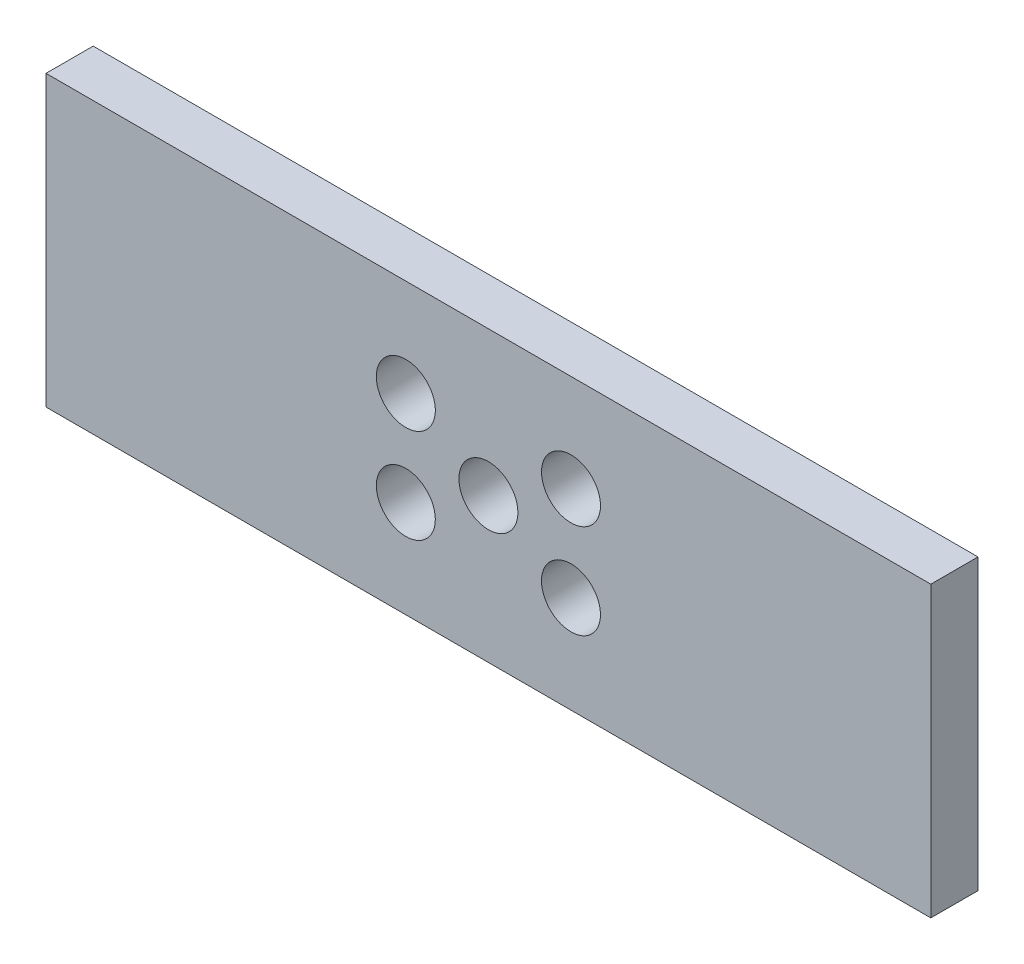
ISO-10303-21;
HEADER;
FILE_DESCRIPTION(('STEP AP214'),'2;1');
FILE_NAME('part.step','',(''),(''),'','','');
FILE_SCHEMA(('AUTOMOTIVE_DESIGN { 1 0 10303 214 1 1 1 1 }'));
ENDSEC;
DATA;
#1=APPLICATION_CONTEXT('core data for automotive mechanical design processes');
#2=APPLICATION_PROTOCOL_DEFINITION('international standard','automotive_design',2000,#1);
#3=PRODUCT_CONTEXT('',#1,'mechanical');
#4=PRODUCT('Part','Part','',(#3));
#5=PRODUCT_RELATED_PRODUCT_CATEGORY('part','',(#4));
#6=PRODUCT_DEFINITION_FORMATION('','',#4);
#7=PRODUCT_DEFINITION_CONTEXT('part definition',#1,'design');
#8=PRODUCT_DEFINITION('design','',#6,#7);
#9=PRODUCT_DEFINITION_SHAPE('','',#8);
#10=(LENGTH_UNIT() NAMED_UNIT(*) SI_UNIT(.MILLI.,.METRE.));
#11=(NAMED_UNIT(*) PLANE_ANGLE_UNIT() SI_UNIT($,.RADIAN.));
#12=(NAMED_UNIT(*) SI_UNIT($,.STERADIAN.) SOLID_ANGLE_UNIT());
#13=UNCERTAINTY_MEASURE_WITH_UNIT(LENGTH_MEASURE(1.E-05),#10,'distance_accuracy_value','');
#14=(GEOMETRIC_REPRESENTATION_CONTEXT(3) GLOBAL_UNCERTAINTY_ASSIGNED_CONTEXT((#13)) GLOBAL_UNIT_ASSIGNED_CONTEXT((#10,
#11,#12)) REPRESENTATION_CONTEXT('',''));
#15=CARTESIAN_POINT('',(0.,0.,0.));
#16=DIRECTION('',(0.,0.,1.));
#17=DIRECTION('',(1.,0.,0.));
#18=AXIS2_PLACEMENT_3D('',#15,#16,#17);
#19=CARTESIAN_POINT('',(-37.5,-12.25,4.));
#20=DIRECTION('',(0.,0.,-1.));
#21=DIRECTION('',(-1.,0.,0.));
#22=AXIS2_PLACEMENT_3D('',#19,#20,#21);
#23=PLANE('',#22);
#24=CARTESIAN_POINT('',(-6.99999999999999,-4.,4.));
#25=DIRECTION('',(0.,0.,1.));
#26=DIRECTION('',(1.,0.,0.));
#27=AXIS2_PLACEMENT_3D('',#24,#25,#26);
#28=CIRCLE('',#27,2.5);
#29=CARTESIAN_POINT('',(-4.49999999999999,-4.,4.));
#30=VERTEX_POINT('',#29);
#31=EDGE_CURVE('E124',#30,#30,#28,.T.);
#32=ORIENTED_EDGE('',*,*,#31,.F.);
#33=EDGE_LOOP('',(#32));
#34=FACE_BOUND('',#33,.T.);
#35=CARTESIAN_POINT('',(7.00000000000001,4.00000000000001,4.));
#36=DIRECTION('',(0.,0.,1.));
#37=DIRECTION('',(1.,0.,0.));
#38=AXIS2_PLACEMENT_3D('',#35,#36,#37);
#39=CIRCLE('',#38,2.5);
#40=CARTESIAN_POINT('',(9.50000000000001,4.00000000000001,4.));
#41=VERTEX_POINT('',#40);
#42=EDGE_CURVE('E112',#41,#41,#39,.T.);
#43=ORIENTED_EDGE('',*,*,#42,.F.);
#44=EDGE_LOOP('',(#43));
#45=FACE_BOUND('',#44,.T.);
#46=DIRECTION('',(0.,-1.,0.));
#47=VECTOR('',#46,1.);
#48=CARTESIAN_POINT('',(-37.5,12.25,4.));
#49=LINE('',#48,#47);
#50=CARTESIAN_POINT('',(-37.5,12.25,4.));
#51=VERTEX_POINT('',#50);
#52=CARTESIAN_POINT('',(-37.5,-12.25,4.));
#53=VERTEX_POINT('',#52);
#54=EDGE_CURVE('E82',#51,#53,#49,.T.);
#55=ORIENTED_EDGE('',*,*,#54,.T.);
#56=DIRECTION('',(1.,0.,0.));
#57=VECTOR('',#56,1.);
#58=CARTESIAN_POINT('',(37.5,-12.25,4.));
#59=LINE('',#58,#57);
#60=CARTESIAN_POINT('',(37.5,-12.25,4.));
#61=VERTEX_POINT('',#60);
#62=EDGE_CURVE('E77',#53,#61,#59,.T.);
#63=ORIENTED_EDGE('',*,*,#62,.T.);
#64=DIRECTION('',(0.,1.,0.));
#65=VECTOR('',#64,1.);
#66=CARTESIAN_POINT('',(37.5,12.25,4.));
#67=LINE('',#66,#65);
#68=CARTESIAN_POINT('',(37.5,12.25,4.));
#69=VERTEX_POINT('',#68);
#70=EDGE_CURVE('E80',#61,#69,#67,.T.);
#71=ORIENTED_EDGE('',*,*,#70,.T.);
#72=DIRECTION('',(-1.,0.,0.));
#73=VECTOR('',#72,1.);
#74=CARTESIAN_POINT('',(37.5,12.25,4.));
#75=LINE('',#74,#73);
#76=EDGE_CURVE('E47',#69,#51,#75,.T.);
#77=ORIENTED_EDGE('',*,*,#76,.T.);
#78=EDGE_LOOP('',(#55,#63,#71,#77));
#79=FACE_BOUND('',#78,.T.);
#80=CARTESIAN_POINT('',(0.,0.,4.));
#81=DIRECTION('',(0.,0.,1.));
#82=DIRECTION('',(1.,0.,0.));
#83=AXIS2_PLACEMENT_3D('',#80,#81,#82);
#84=CIRCLE('',#83,2.5);
#85=CARTESIAN_POINT('',(2.50000000000001,0.,4.));
#86=VERTEX_POINT('',#85);
#87=EDGE_CURVE('E97',#86,#86,#84,.T.);
#88=ORIENTED_EDGE('',*,*,#87,.F.);
#89=EDGE_LOOP('',(#88));
#90=FACE_BOUND('',#89,.T.);
#91=CARTESIAN_POINT('',(7.00000000000001,-4.,4.));
#92=DIRECTION('',(0.,0.,1.));
#93=DIRECTION('',(-1.,0.,0.));
#94=AXIS2_PLACEMENT_3D('',#91,#92,#93);
#95=CIRCLE('',#94,2.5);
#96=CARTESIAN_POINT('',(4.50000000000001,-4.,4.));
#97=VERTEX_POINT('',#96);
#98=EDGE_CURVE('E118',#97,#97,#95,.T.);
#99=ORIENTED_EDGE('',*,*,#98,.F.);
#100=EDGE_LOOP('',(#99));
#101=FACE_BOUND('',#100,.T.);
#102=CARTESIAN_POINT('',(-6.99999999999999,4.00000000000001,4.));
#103=DIRECTION('',(0.,0.,1.));
#104=DIRECTION('',(-1.,0.,0.));
#105=AXIS2_PLACEMENT_3D('',#102,#103,#104);
#106=CIRCLE('',#105,2.5);
#107=CARTESIAN_POINT('',(-9.49999999999999,4.00000000000001,4.));
#108=VERTEX_POINT('',#107);
#109=EDGE_CURVE('E130',#108,#108,#106,.T.);
#110=ORIENTED_EDGE('',*,*,#109,.F.);
#111=EDGE_LOOP('',(#110));
#112=FACE_BOUND('',#111,.T.);
#113=ADVANCED_FACE('F30',(#34,#45,#79,#90,#101,#112),#23,.F.);
#114=CARTESIAN_POINT('',(-37.5,-12.25,0.));
#115=DIRECTION('',(0.,0.,-1.));
#116=DIRECTION('',(-1.,0.,0.));
#117=AXIS2_PLACEMENT_3D('',#114,#115,#116);
#118=PLANE('',#117);
#119=CARTESIAN_POINT('',(-6.99999999999999,-4.,0.));
#120=DIRECTION('',(0.,0.,1.));
#121=DIRECTION('',(1.,0.,0.));
#122=AXIS2_PLACEMENT_3D('',#119,#120,#121);
#123=CIRCLE('',#122,2.5);
#124=CARTESIAN_POINT('',(-4.49999999999999,-4.,0.));
#125=VERTEX_POINT('',#124);
#126=EDGE_CURVE('E127',#125,#125,#123,.T.);
#127=ORIENTED_EDGE('',*,*,#126,.T.);
#128=EDGE_LOOP('',(#127));
#129=FACE_BOUND('',#128,.T.);
#130=CARTESIAN_POINT('',(7.00000000000001,4.00000000000001,0.));
#131=DIRECTION('',(0.,0.,1.));
#132=DIRECTION('',(1.,0.,0.));
#133=AXIS2_PLACEMENT_3D('',#130,#131,#132);
#134=CIRCLE('',#133,2.5);
#135=CARTESIAN_POINT('',(9.50000000000001,4.00000000000001,0.));
#136=VERTEX_POINT('',#135);
#137=EDGE_CURVE('E115',#136,#136,#134,.T.);
#138=ORIENTED_EDGE('',*,*,#137,.T.);
#139=EDGE_LOOP('',(#138));
#140=FACE_BOUND('',#139,.T.);
#141=DIRECTION('',(0.,-1.,0.));
#142=VECTOR('',#141,1.);
#143=CARTESIAN_POINT('',(-37.5,12.25,0.));
#144=LINE('',#143,#142);
#145=CARTESIAN_POINT('',(-37.5,12.25,0.));
#146=VERTEX_POINT('',#145);
#147=CARTESIAN_POINT('',(-37.5,-12.25,0.));
#148=VERTEX_POINT('',#147);
#149=EDGE_CURVE('E94',#146,#148,#144,.T.);
#150=ORIENTED_EDGE('',*,*,#149,.F.);
#151=DIRECTION('',(-1.,0.,0.));
#152=VECTOR('',#151,1.);
#153=CARTESIAN_POINT('',(37.5,12.25,0.));
#154=LINE('',#153,#152);
#155=CARTESIAN_POINT('',(37.5,12.25,0.));
#156=VERTEX_POINT('',#155);
#157=EDGE_CURVE('E70',#156,#146,#154,.T.);
#158=ORIENTED_EDGE('',*,*,#157,.F.);
#159=DIRECTION('',(0.,1.,0.));
#160=VECTOR('',#159,1.);
#161=CARTESIAN_POINT('',(37.5,12.25,0.));
#162=LINE('',#161,#160);
#163=CARTESIAN_POINT('',(37.5,-12.25,0.));
#164=VERTEX_POINT('',#163);
#165=EDGE_CURVE('E64',#164,#156,#162,.T.);
#166=ORIENTED_EDGE('',*,*,#165,.F.);
#167=DIRECTION('',(1.,0.,0.));
#168=VECTOR('',#167,1.);
#169=CARTESIAN_POINT('',(37.5,-12.25,0.));
#170=LINE('',#169,#168);
#171=EDGE_CURVE('E86',#148,#164,#170,.T.);
#172=ORIENTED_EDGE('',*,*,#171,.F.);
#173=EDGE_LOOP('',(#150,#158,#166,#172));
#174=FACE_BOUND('',#173,.T.);
#175=CARTESIAN_POINT('',(0.,0.,0.));
#176=DIRECTION('',(0.,0.,1.));
#177=DIRECTION('',(1.,0.,0.));
#178=AXIS2_PLACEMENT_3D('',#175,#176,#177);
#179=CIRCLE('',#178,2.5);
#180=CARTESIAN_POINT('',(2.50000000000001,0.,0.));
#181=VERTEX_POINT('',#180);
#182=EDGE_CURVE('E109',#181,#181,#179,.T.);
#183=ORIENTED_EDGE('',*,*,#182,.T.);
#184=EDGE_LOOP('',(#183));
#185=FACE_BOUND('',#184,.T.);
#186=CARTESIAN_POINT('',(7.00000000000001,-4.,0.));
#187=DIRECTION('',(0.,0.,1.));
#188=DIRECTION('',(-1.,0.,0.));
#189=AXIS2_PLACEMENT_3D('',#186,#187,#188);
#190=CIRCLE('',#189,2.5);
#191=CARTESIAN_POINT('',(4.50000000000001,-4.,0.));
#192=VERTEX_POINT('',#191);
#193=EDGE_CURVE('E121',#192,#192,#190,.T.);
#194=ORIENTED_EDGE('',*,*,#193,.T.);
#195=EDGE_LOOP('',(#194));
#196=FACE_BOUND('',#195,.T.);
#197=CARTESIAN_POINT('',(-6.99999999999999,4.00000000000001,0.));
#198=DIRECTION('',(0.,0.,1.));
#199=DIRECTION('',(-1.,0.,0.));
#200=AXIS2_PLACEMENT_3D('',#197,#198,#199);
#201=CIRCLE('',#200,2.5);
#202=CARTESIAN_POINT('',(-9.49999999999999,4.00000000000001,0.));
#203=VERTEX_POINT('',#202);
#204=EDGE_CURVE('E133',#203,#203,#201,.T.);
#205=ORIENTED_EDGE('',*,*,#204,.T.);
#206=EDGE_LOOP('',(#205));
#207=FACE_BOUND('',#206,.T.);
#208=ADVANCED_FACE('F105',(#129,#140,#174,#185,#196,#207),#118,.T.);
#209=CARTESIAN_POINT('',(-37.5,12.25,4.));
#210=DIRECTION('',(1.,0.,0.));
#211=DIRECTION('',(0.,0.,-1.));
#212=AXIS2_PLACEMENT_3D('',#209,#210,#211);
#213=PLANE('',#212);
#214=ORIENTED_EDGE('',*,*,#149,.T.);
#215=DIRECTION('',(0.,0.,-1.));
#216=VECTOR('',#215,1.);
#217=CARTESIAN_POINT('',(-37.5,-12.25,4.));
#218=LINE('',#217,#216);
#219=EDGE_CURVE('E11',#53,#148,#218,.T.);
#220=ORIENTED_EDGE('',*,*,#219,.F.);
#221=ORIENTED_EDGE('',*,*,#54,.F.);
#222=DIRECTION('',(0.,0.,-1.));
#223=VECTOR('',#222,1.);
#224=CARTESIAN_POINT('',(-37.5,12.25,4.));
#225=LINE('',#224,#223);
#226=EDGE_CURVE('E90',#51,#146,#225,.T.);
#227=ORIENTED_EDGE('',*,*,#226,.T.);
#228=EDGE_LOOP('',(#214,#220,#221,#227));
#229=FACE_BOUND('',#228,.T.);
#230=ADVANCED_FACE('F32',(#229),#213,.F.);
#231=CARTESIAN_POINT('',(37.5,-12.25,4.));
#232=DIRECTION('',(0.,1.,0.));
#233=DIRECTION('',(-1.,0.,0.));
#234=AXIS2_PLACEMENT_3D('',#231,#232,#233);
#235=PLANE('',#234);
#236=ORIENTED_EDGE('',*,*,#171,.T.);
#237=DIRECTION('',(0.,0.,-1.));
#238=VECTOR('',#237,1.);
#239=CARTESIAN_POINT('',(37.5,-12.25,4.));
#240=LINE('',#239,#238);
#241=EDGE_CURVE('E39',#61,#164,#240,.T.);
#242=ORIENTED_EDGE('',*,*,#241,.F.);
#243=ORIENTED_EDGE('',*,*,#62,.F.);
#244=ORIENTED_EDGE('',*,*,#219,.T.);
#245=EDGE_LOOP('',(#236,#242,#243,#244));
#246=FACE_BOUND('',#245,.T.);
#247=ADVANCED_FACE('F85',(#246),#235,.F.);
#248=CARTESIAN_POINT('',(37.5,12.25,4.));
#249=DIRECTION('',(-1.,0.,0.));
#250=DIRECTION('',(0.,0.,1.));
#251=AXIS2_PLACEMENT_3D('',#248,#249,#250);
#252=PLANE('',#251);
#253=ORIENTED_EDGE('',*,*,#165,.T.);
#254=DIRECTION('',(0.,0.,-1.));
#255=VECTOR('',#254,1.);
#256=CARTESIAN_POINT('',(37.5,12.25,4.));
#257=LINE('',#256,#255);
#258=EDGE_CURVE('E87',#69,#156,#257,.T.);
#259=ORIENTED_EDGE('',*,*,#258,.F.);
#260=ORIENTED_EDGE('',*,*,#70,.F.);
#261=ORIENTED_EDGE('',*,*,#241,.T.);
#262=EDGE_LOOP('',(#253,#259,#260,#261));
#263=FACE_BOUND('',#262,.T.);
#264=ADVANCED_FACE('F88',(#263),#252,.F.);
#265=CARTESIAN_POINT('',(37.5,12.25,4.));
#266=DIRECTION('',(0.,-1.,0.));
#267=DIRECTION('',(1.,0.,0.));
#268=AXIS2_PLACEMENT_3D('',#265,#266,#267);
#269=PLANE('',#268);
#270=ORIENTED_EDGE('',*,*,#157,.T.);
#271=ORIENTED_EDGE('',*,*,#226,.F.);
#272=ORIENTED_EDGE('',*,*,#76,.F.);
#273=ORIENTED_EDGE('',*,*,#258,.T.);
#274=EDGE_LOOP('',(#270,#271,#272,#273));
#275=FACE_BOUND('',#274,.T.);
#276=ADVANCED_FACE('F102',(#275),#269,.F.);
#277=CARTESIAN_POINT('',(0.,0.,4.));
#278=DIRECTION('',(0.,0.,-1.));
#279=DIRECTION('',(-1.,0.,0.));
#280=AXIS2_PLACEMENT_3D('',#277,#278,#279);
#281=CYLINDRICAL_SURFACE('',#280,2.5);
#282=ORIENTED_EDGE('',*,*,#87,.T.);
#283=EDGE_LOOP('',(#282));
#284=FACE_BOUND('',#283,.T.);
#285=ORIENTED_EDGE('',*,*,#182,.F.);
#286=EDGE_LOOP('',(#285));
#287=FACE_BOUND('',#286,.T.);
#288=ADVANCED_FACE('F153',(#284,#287),#281,.F.);
#289=CARTESIAN_POINT('',(7.00000000000001,4.00000000000001,4.));
#290=DIRECTION('',(0.,0.,-1.));
#291=DIRECTION('',(-1.,0.,0.));
#292=AXIS2_PLACEMENT_3D('',#289,#290,#291);
#293=CYLINDRICAL_SURFACE('',#292,2.5);
#294=ORIENTED_EDGE('',*,*,#42,.T.);
#295=EDGE_LOOP('',(#294));
#296=FACE_BOUND('',#295,.T.);
#297=ORIENTED_EDGE('',*,*,#137,.F.);
#298=EDGE_LOOP('',(#297));
#299=FACE_BOUND('',#298,.T.);
#300=ADVANCED_FACE('F199',(#296,#299),#293,.F.);
#301=CARTESIAN_POINT('',(7.00000000000001,-4.,4.));
#302=DIRECTION('',(0.,0.,-1.));
#303=DIRECTION('',(-1.,0.,0.));
#304=AXIS2_PLACEMENT_3D('',#301,#302,#303);
#305=CYLINDRICAL_SURFACE('',#304,2.5);
#306=ORIENTED_EDGE('',*,*,#98,.T.);
#307=EDGE_LOOP('',(#306));
#308=FACE_BOUND('',#307,.T.);
#309=ORIENTED_EDGE('',*,*,#193,.F.);
#310=EDGE_LOOP('',(#309));
#311=FACE_BOUND('',#310,.T.);
#312=ADVANCED_FACE('F207',(#308,#311),#305,.F.);
#313=CARTESIAN_POINT('',(-6.99999999999999,-4.,4.));
#314=DIRECTION('',(0.,0.,-1.));
#315=DIRECTION('',(-1.,0.,0.));
#316=AXIS2_PLACEMENT_3D('',#313,#314,#315);
#317=CYLINDRICAL_SURFACE('',#316,2.5);
#318=ORIENTED_EDGE('',*,*,#31,.T.);
#319=EDGE_LOOP('',(#318));
#320=FACE_BOUND('',#319,.T.);
#321=ORIENTED_EDGE('',*,*,#126,.F.);
#322=EDGE_LOOP('',(#321));
#323=FACE_BOUND('',#322,.T.);
#324=ADVANCED_FACE('F215',(#320,#323),#317,.F.);
#325=CARTESIAN_POINT('',(-6.99999999999999,4.00000000000001,4.));
#326=DIRECTION('',(0.,0.,-1.));
#327=DIRECTION('',(-1.,0.,0.));
#328=AXIS2_PLACEMENT_3D('',#325,#326,#327);
#329=CYLINDRICAL_SURFACE('',#328,2.5);
#330=ORIENTED_EDGE('',*,*,#109,.T.);
#331=EDGE_LOOP('',(#330));
#332=FACE_BOUND('',#331,.T.);
#333=ORIENTED_EDGE('',*,*,#204,.F.);
#334=EDGE_LOOP('',(#333));
#335=FACE_BOUND('',#334,.T.);
#336=ADVANCED_FACE('F139',(#332,#335),#329,.F.);
#337=CLOSED_SHELL('',(#113,#208,#230,#247,#264,#276,#288,#300,#312,#324,#336));
#338=MANIFOLD_SOLID_BREP('B2',#337);
#339=ADVANCED_BREP_SHAPE_REPRESENTATION('',(#18,#338),#14);
#340=SHAPE_DEFINITION_REPRESENTATION(#9,#339);
ENDSEC;
END-ISO-10303-21;
